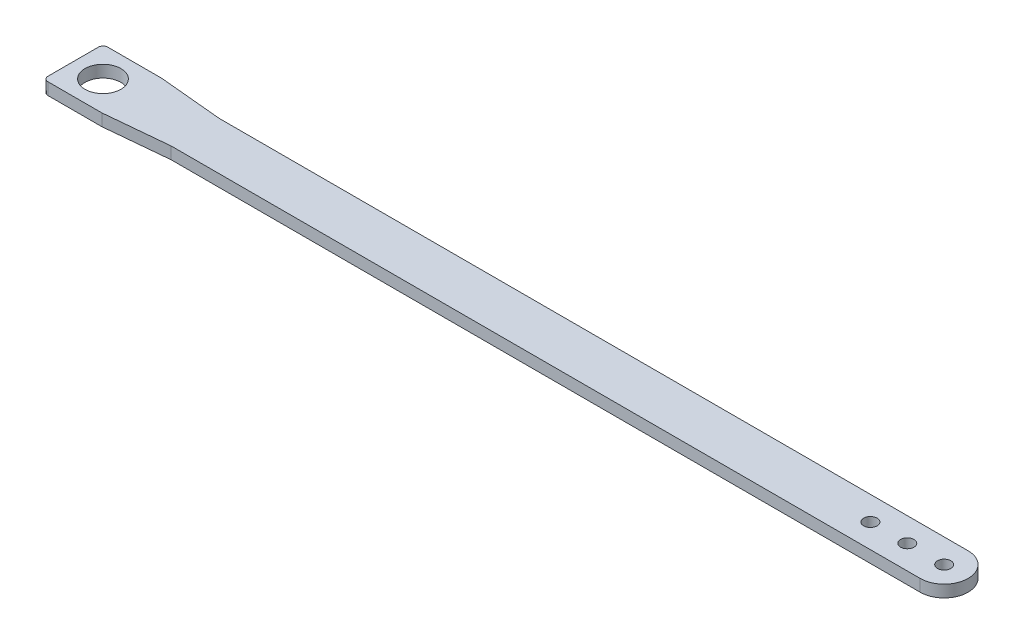
ISO-10303-21;
HEADER;
FILE_DESCRIPTION(('STEP AP214'),'2;1');
FILE_NAME('part.step','',(''),(''),'','','');
FILE_SCHEMA(('AUTOMOTIVE_DESIGN { 1 0 10303 214 1 1 1 1 }'));
ENDSEC;
DATA;
#1=APPLICATION_CONTEXT('core data for automotive mechanical design processes');
#2=APPLICATION_PROTOCOL_DEFINITION('international standard','automotive_design',2000,#1);
#3=PRODUCT_CONTEXT('',#1,'mechanical');
#4=PRODUCT('Part','Part','',(#3));
#5=PRODUCT_RELATED_PRODUCT_CATEGORY('part','',(#4));
#6=PRODUCT_DEFINITION_FORMATION('','',#4);
#7=PRODUCT_DEFINITION_CONTEXT('part definition',#1,'design');
#8=PRODUCT_DEFINITION('design','',#6,#7);
#9=PRODUCT_DEFINITION_SHAPE('','',#8);
#10=(LENGTH_UNIT() NAMED_UNIT(*) SI_UNIT(.MILLI.,.METRE.));
#11=(NAMED_UNIT(*) PLANE_ANGLE_UNIT() SI_UNIT($,.RADIAN.));
#12=(NAMED_UNIT(*) SI_UNIT($,.STERADIAN.) SOLID_ANGLE_UNIT());
#13=UNCERTAINTY_MEASURE_WITH_UNIT(LENGTH_MEASURE(1.E-05),#10,'distance_accuracy_value','');
#14=(GEOMETRIC_REPRESENTATION_CONTEXT(3) GLOBAL_UNCERTAINTY_ASSIGNED_CONTEXT((#13)) GLOBAL_UNIT_ASSIGNED_CONTEXT((#10,
#11,#12)) REPRESENTATION_CONTEXT('',''));
#15=CARTESIAN_POINT('',(0.,0.,0.));
#16=DIRECTION('',(0.,0.,1.));
#17=DIRECTION('',(1.,0.,0.));
#18=AXIS2_PLACEMENT_3D('',#15,#16,#17);
#19=CARTESIAN_POINT('',(187.756799999999,3.175,-0.63500000000008));
#20=DIRECTION('',(0.,1.,0.));
#21=DIRECTION('',(0.,0.,1.));
#22=AXIS2_PLACEMENT_3D('',#19,#20,#21);
#23=CYLINDRICAL_SURFACE('',#22,6.35000000000004);
#24=CARTESIAN_POINT('',(187.756799999999,6.35,-0.63500000000008));
#25=DIRECTION('',(0.,1.,0.));
#26=DIRECTION('',(0.,0.,1.));
#27=AXIS2_PLACEMENT_3D('',#24,#25,#26);
#28=CIRCLE('',#27,6.35000000000004);
#29=CARTESIAN_POINT('',(187.756799999999,6.35,5.71500000000001));
#30=VERTEX_POINT('',#29);
#31=CARTESIAN_POINT('',(187.756799999999,6.35,-6.98500000000008));
#32=VERTEX_POINT('',#31);
#33=EDGE_CURVE('E151',#30,#32,#28,.T.);
#34=ORIENTED_EDGE('',*,*,#33,.F.);
#35=DIRECTION('',(0.,1.,0.));
#36=VECTOR('',#35,1.);
#37=CARTESIAN_POINT('',(187.756799999999,3.175,5.71500000000001));
#38=LINE('',#37,#36);
#39=CARTESIAN_POINT('',(187.756799999999,3.175,5.71500000000001));
#40=VERTEX_POINT('',#39);
#41=EDGE_CURVE('E141',#40,#30,#38,.T.);
#42=ORIENTED_EDGE('',*,*,#41,.F.);
#43=CARTESIAN_POINT('',(187.756799999999,3.175,-0.63500000000008));
#44=DIRECTION('',(0.,1.,0.));
#45=DIRECTION('',(0.,0.,1.));
#46=AXIS2_PLACEMENT_3D('',#43,#44,#45);
#47=CIRCLE('',#46,6.35000000000004);
#48=CARTESIAN_POINT('',(187.756799999999,3.175,-6.98500000000008));
#49=VERTEX_POINT('',#48);
#50=EDGE_CURVE('E144',#40,#49,#47,.T.);
#51=ORIENTED_EDGE('',*,*,#50,.T.);
#52=DIRECTION('',(0.,1.,0.));
#53=VECTOR('',#52,1.);
#54=CARTESIAN_POINT('',(187.756799999999,3.175,-6.98500000000008));
#55=LINE('',#54,#53);
#56=EDGE_CURVE('E158',#49,#32,#55,.T.);
#57=ORIENTED_EDGE('',*,*,#56,.T.);
#58=EDGE_LOOP('',(#34,#42,#51,#57));
#59=FACE_BOUND('',#58,.T.);
#60=ADVANCED_FACE('F39',(#59),#23,.T.);
#61=CARTESIAN_POINT('',(-187.756799999999,3.175,5.71500000000001));
#62=DIRECTION('',(0.,0.,1.));
#63=DIRECTION('',(1.,0.,0.));
#64=AXIS2_PLACEMENT_3D('',#61,#62,#63);
#65=PLANE('',#64);
#66=DIRECTION('',(0.,1.,0.));
#67=VECTOR('',#66,1.);
#68=CARTESIAN_POINT('',(-10.7713521631986,-13.6843970823459,5.71500000000001));
#69=LINE('',#68,#67);
#70=CARTESIAN_POINT('',(-10.7713521631986,3.175,5.71500000000001));
#71=VERTEX_POINT('',#70);
#72=CARTESIAN_POINT('',(-10.7713521631986,6.35,5.71500000000001));
#73=VERTEX_POINT('',#72);
#74=EDGE_CURVE('E116',#71,#73,#69,.T.);
#75=ORIENTED_EDGE('',*,*,#74,.F.);
#76=DIRECTION('',(1.,0.,0.));
#77=VECTOR('',#76,1.);
#78=CARTESIAN_POINT('',(-187.756799999999,3.175,5.71500000000001));
#79=LINE('',#78,#77);
#80=EDGE_CURVE('E161',#71,#40,#79,.T.);
#81=ORIENTED_EDGE('',*,*,#80,.T.);
#82=ORIENTED_EDGE('',*,*,#41,.T.);
#83=DIRECTION('',(1.,0.,0.));
#84=VECTOR('',#83,1.);
#85=CARTESIAN_POINT('',(-187.756799999999,6.35,5.71500000000001));
#86=LINE('',#85,#84);
#87=EDGE_CURVE('E132',#73,#30,#86,.T.);
#88=ORIENTED_EDGE('',*,*,#87,.F.);
#89=EDGE_LOOP('',(#75,#81,#82,#88));
#90=FACE_BOUND('',#89,.T.);
#91=ADVANCED_FACE('F139',(#90),#65,.T.);
#92=CARTESIAN_POINT('',(187.756799999999,3.175,-6.98500000000008));
#93=DIRECTION('',(0.,0.,-1.));
#94=DIRECTION('',(-1.,0.,0.));
#95=AXIS2_PLACEMENT_3D('',#92,#93,#94);
#96=PLANE('',#95);
#97=DIRECTION('',(0.,1.,0.));
#98=VECTOR('',#97,1.);
#99=CARTESIAN_POINT('',(-10.7713521631986,-13.6843970823459,-6.98500000000012));
#100=LINE('',#99,#98);
#101=CARTESIAN_POINT('',(-10.7713521631986,3.175,-6.98500000000006));
#102=VERTEX_POINT('',#101);
#103=CARTESIAN_POINT('',(-10.7713521631986,6.35,-6.98500000000006));
#104=VERTEX_POINT('',#103);
#105=EDGE_CURVE('E60',#102,#104,#100,.T.);
#106=ORIENTED_EDGE('',*,*,#105,.T.);
#107=DIRECTION('',(-1.,0.,0.));
#108=VECTOR('',#107,1.);
#109=CARTESIAN_POINT('',(187.756799999999,6.35,-6.98500000000008));
#110=LINE('',#109,#108);
#111=EDGE_CURVE('E145',#32,#104,#110,.T.);
#112=ORIENTED_EDGE('',*,*,#111,.F.);
#113=ORIENTED_EDGE('',*,*,#56,.F.);
#114=DIRECTION('',(-1.,0.,0.));
#115=VECTOR('',#114,1.);
#116=CARTESIAN_POINT('',(187.756799999999,3.175,-6.98500000000008));
#117=LINE('',#116,#115);
#118=EDGE_CURVE('E55',#49,#102,#117,.T.);
#119=ORIENTED_EDGE('',*,*,#118,.T.);
#120=EDGE_LOOP('',(#106,#112,#113,#119));
#121=FACE_BOUND('',#120,.T.);
#122=ADVANCED_FACE('F262',(#121),#96,.T.);
#123=CARTESIAN_POINT('',(187.756799999999,3.175,-0.63500000000008));
#124=DIRECTION('',(0.,1.,0.));
#125=DIRECTION('',(0.,0.,1.));
#126=AXIS2_PLACEMENT_3D('',#123,#124,#125);
#127=PLANE('',#126);
#128=ORIENTED_EDGE('',*,*,#80,.F.);
#129=DIRECTION('',(-0.995556969872185,0.,0.0941611370944179));
#130=VECTOR('',#129,1.);
#131=CARTESIAN_POINT('',(-27.5558424363708,3.175,7.30250000000001));
#132=LINE('',#131,#130);
#133=CARTESIAN_POINT('',(-27.5558424363708,3.175,7.30250000000001));
#134=VERTEX_POINT('',#133);
#135=EDGE_CURVE('E122',#71,#134,#132,.T.);
#136=ORIENTED_EDGE('',*,*,#135,.T.);
#137=DIRECTION('',(-1.,0.,0.));
#138=VECTOR('',#137,1.);
#139=CARTESIAN_POINT('',(-41.5253638157058,3.175,7.30250000000001));
#140=LINE('',#139,#138);
#141=CARTESIAN_POINT('',(-41.8428638157058,3.175,7.30250000000001));
#142=VERTEX_POINT('',#141);
#143=EDGE_CURVE('E190',#134,#142,#140,.T.);
#144=ORIENTED_EDGE('',*,*,#143,.T.);
#145=CARTESIAN_POINT('',(-41.8428638157058,3.175,6.03250000000001));
#146=DIRECTION('',(0.,1.,0.));
#147=DIRECTION('',(0.,0.,1.));
#148=AXIS2_PLACEMENT_3D('',#145,#146,#147);
#149=CIRCLE('',#148,1.27);
#150=CARTESIAN_POINT('',(-43.1128638157058,3.175,6.03250000000001));
#151=VERTEX_POINT('',#150);
#152=EDGE_CURVE('E48',#142,#151,#149,.F.);
#153=ORIENTED_EDGE('',*,*,#152,.T.);
#154=DIRECTION('',(0.,0.,-1.));
#155=VECTOR('',#154,1.);
#156=CARTESIAN_POINT('',(-43.1128638157058,3.175,-8.57250000000008));
#157=LINE('',#156,#155);
#158=CARTESIAN_POINT('',(-43.1128638157058,3.175,-7.30250000000008));
#159=VERTEX_POINT('',#158);
#160=EDGE_CURVE('E187',#151,#159,#157,.T.);
#161=ORIENTED_EDGE('',*,*,#160,.T.);
#162=CARTESIAN_POINT('',(-41.8428638157058,3.175,-7.30250000000008));
#163=DIRECTION('',(0.,1.,0.));
#164=DIRECTION('',(0.,0.,1.));
#165=AXIS2_PLACEMENT_3D('',#162,#163,#164);
#166=CIRCLE('',#165,1.27);
#167=CARTESIAN_POINT('',(-41.8428638157058,3.175,-8.57250000000008));
#168=VERTEX_POINT('',#167);
#169=EDGE_CURVE('E177',#159,#168,#166,.F.);
#170=ORIENTED_EDGE('',*,*,#169,.T.);
#171=DIRECTION('',(1.,0.,0.));
#172=VECTOR('',#171,1.);
#173=CARTESIAN_POINT('',(-41.5253638157058,3.175,-8.57250000000008));
#174=LINE('',#173,#172);
#175=CARTESIAN_POINT('',(-27.5558424363708,3.175,-8.57250000000008));
#176=VERTEX_POINT('',#175);
#177=EDGE_CURVE('E219',#168,#176,#174,.T.);
#178=ORIENTED_EDGE('',*,*,#177,.T.);
#179=DIRECTION('',(0.995556969872185,0.,0.0941611370944156));
#180=VECTOR('',#179,1.);
#181=CARTESIAN_POINT('',(-27.5558424363708,3.175,-8.57250000000008));
#182=LINE('',#181,#180);
#183=EDGE_CURVE('E428',#176,#102,#182,.T.);
#184=ORIENTED_EDGE('',*,*,#183,.T.);
#185=ORIENTED_EDGE('',*,*,#118,.F.);
#186=ORIENTED_EDGE('',*,*,#50,.F.);
#187=EDGE_LOOP('',(#128,#136,#144,#153,#161,#170,#178,#184,#185,#186));
#188=FACE_BOUND('',#187,.T.);
#189=CARTESIAN_POINT('',(168.198799999999,3.175,-0.63500000000008));
#190=DIRECTION('',(0.,1.,0.));
#191=DIRECTION('',(0.,0.,1.));
#192=AXIS2_PLACEMENT_3D('',#189,#190,#191);
#193=CIRCLE('',#192,1.77800000000001);
#194=CARTESIAN_POINT('',(168.198799999999,3.175,1.14299999999993));
#195=VERTEX_POINT('',#194);
#196=EDGE_CURVE('E234',#195,#195,#193,.T.);
#197=ORIENTED_EDGE('',*,*,#196,.T.);
#198=EDGE_LOOP('',(#197));
#199=FACE_BOUND('',#198,.T.);
#200=CARTESIAN_POINT('',(177.977799999999,3.175,-0.63500000000008));
#201=DIRECTION('',(0.,1.,0.));
#202=DIRECTION('',(0.,0.,1.));
#203=AXIS2_PLACEMENT_3D('',#200,#201,#202);
#204=CIRCLE('',#203,1.77800000000001);
#205=CARTESIAN_POINT('',(177.977799999999,3.175,1.14299999999993));
#206=VERTEX_POINT('',#205);
#207=EDGE_CURVE('E227',#206,#206,#204,.T.);
#208=ORIENTED_EDGE('',*,*,#207,.T.);
#209=EDGE_LOOP('',(#208));
#210=FACE_BOUND('',#209,.T.);
#211=CARTESIAN_POINT('',(-35.2043999999998,3.175,-0.635000000000079));
#212=DIRECTION('',(0.,1.,0.));
#213=DIRECTION('',(0.,0.,1.));
#214=AXIS2_PLACEMENT_3D('',#211,#212,#213);
#215=CIRCLE('',#214,4.7625);
#216=CARTESIAN_POINT('',(-35.2043999999998,3.175,4.12749999999992));
#217=VERTEX_POINT('',#216);
#218=EDGE_CURVE('E242',#217,#217,#215,.T.);
#219=ORIENTED_EDGE('',*,*,#218,.T.);
#220=EDGE_LOOP('',(#219));
#221=FACE_BOUND('',#220,.T.);
#222=CARTESIAN_POINT('',(187.756799999999,3.175,-0.63500000000008));
#223=DIRECTION('',(0.,1.,0.));
#224=DIRECTION('',(0.,0.,-1.));
#225=AXIS2_PLACEMENT_3D('',#222,#223,#224);
#226=CIRCLE('',#225,1.77800000000001);
#227=CARTESIAN_POINT('',(187.756799999999,3.175,-2.41300000000009));
#228=VERTEX_POINT('',#227);
#229=EDGE_CURVE('E247',#228,#228,#226,.T.);
#230=ORIENTED_EDGE('',*,*,#229,.T.);
#231=EDGE_LOOP('',(#230));
#232=FACE_BOUND('',#231,.T.);
#233=ADVANCED_FACE('F185',(#188,#199,#210,#221,#232),#127,.F.);
#234=CARTESIAN_POINT('',(187.756799999999,6.35,-0.63500000000008));
#235=DIRECTION('',(0.,1.,0.));
#236=DIRECTION('',(0.,0.,1.));
#237=AXIS2_PLACEMENT_3D('',#234,#235,#236);
#238=PLANE('',#237);
#239=DIRECTION('',(0.995556969872185,0.,-0.0941611370944179));
#240=VECTOR('',#239,1.);
#241=CARTESIAN_POINT('',(-27.5558424363708,6.35,7.30250000000001));
#242=LINE('',#241,#240);
#243=CARTESIAN_POINT('',(-27.5558424363708,6.35,7.30250000000001));
#244=VERTEX_POINT('',#243);
#245=EDGE_CURVE('E120',#244,#73,#242,.T.);
#246=ORIENTED_EDGE('',*,*,#245,.T.);
#247=ORIENTED_EDGE('',*,*,#87,.T.);
#248=ORIENTED_EDGE('',*,*,#33,.T.);
#249=ORIENTED_EDGE('',*,*,#111,.T.);
#250=DIRECTION('',(-0.995556969872185,0.,-0.0941611370944155));
#251=VECTOR('',#250,1.);
#252=CARTESIAN_POINT('',(-27.5558424363708,6.35,-8.57250000000008));
#253=LINE('',#252,#251);
#254=CARTESIAN_POINT('',(-27.5558424363708,6.35,-8.57250000000008));
#255=VERTEX_POINT('',#254);
#256=EDGE_CURVE('E435',#104,#255,#253,.T.);
#257=ORIENTED_EDGE('',*,*,#256,.T.);
#258=DIRECTION('',(-1.,0.,0.));
#259=VECTOR('',#258,1.);
#260=CARTESIAN_POINT('',(-41.5253638157058,6.35,-8.57250000000008));
#261=LINE('',#260,#259);
#262=CARTESIAN_POINT('',(-41.8428638157058,6.35,-8.57250000000008));
#263=VERTEX_POINT('',#262);
#264=EDGE_CURVE('E213',#255,#263,#261,.T.);
#265=ORIENTED_EDGE('',*,*,#264,.T.);
#266=CARTESIAN_POINT('',(-41.8428638157058,6.35,-7.30250000000008));
#267=DIRECTION('',(0.,1.,0.));
#268=DIRECTION('',(0.,0.,1.));
#269=AXIS2_PLACEMENT_3D('',#266,#267,#268);
#270=CIRCLE('',#269,1.27);
#271=CARTESIAN_POINT('',(-43.1128638157058,6.35,-7.30250000000008));
#272=VERTEX_POINT('',#271);
#273=EDGE_CURVE('E168',#263,#272,#270,.T.);
#274=ORIENTED_EDGE('',*,*,#273,.T.);
#275=DIRECTION('',(0.,0.,1.));
#276=VECTOR('',#275,1.);
#277=CARTESIAN_POINT('',(-43.1128638157058,6.35,-8.57250000000008));
#278=LINE('',#277,#276);
#279=CARTESIAN_POINT('',(-43.1128638157058,6.35,6.03250000000001));
#280=VERTEX_POINT('',#279);
#281=EDGE_CURVE('E203',#272,#280,#278,.T.);
#282=ORIENTED_EDGE('',*,*,#281,.T.);
#283=CARTESIAN_POINT('',(-41.8428638157058,6.35,6.03250000000001));
#284=DIRECTION('',(0.,1.,0.));
#285=DIRECTION('',(0.,0.,1.));
#286=AXIS2_PLACEMENT_3D('',#283,#284,#285);
#287=CIRCLE('',#286,1.27);
#288=CARTESIAN_POINT('',(-41.8428638157058,6.35,7.30250000000001));
#289=VERTEX_POINT('',#288);
#290=EDGE_CURVE('E171',#280,#289,#287,.T.);
#291=ORIENTED_EDGE('',*,*,#290,.T.);
#292=DIRECTION('',(1.,0.,0.));
#293=VECTOR('',#292,1.);
#294=CARTESIAN_POINT('',(-41.5253638157058,6.35,7.30250000000001));
#295=LINE('',#294,#293);
#296=EDGE_CURVE('E135',#289,#244,#295,.T.);
#297=ORIENTED_EDGE('',*,*,#296,.T.);
#298=EDGE_LOOP('',(#246,#247,#248,#249,#257,#265,#274,#282,#291,#297));
#299=FACE_BOUND('',#298,.T.);
#300=CARTESIAN_POINT('',(168.198799999999,6.35,-0.63500000000008));
#301=DIRECTION('',(0.,1.,0.));
#302=DIRECTION('',(0.,0.,1.));
#303=AXIS2_PLACEMENT_3D('',#300,#301,#302);
#304=CIRCLE('',#303,1.77800000000001);
#305=CARTESIAN_POINT('',(168.198799999999,6.35,1.14299999999993));
#306=VERTEX_POINT('',#305);
#307=EDGE_CURVE('E223',#306,#306,#304,.T.);
#308=ORIENTED_EDGE('',*,*,#307,.F.);
#309=EDGE_LOOP('',(#308));
#310=FACE_BOUND('',#309,.T.);
#311=CARTESIAN_POINT('',(177.977799999999,6.35,-0.63500000000008));
#312=DIRECTION('',(0.,1.,0.));
#313=DIRECTION('',(0.,0.,1.));
#314=AXIS2_PLACEMENT_3D('',#311,#312,#313);
#315=CIRCLE('',#314,1.77800000000001);
#316=CARTESIAN_POINT('',(177.977799999999,6.35,1.14299999999993));
#317=VERTEX_POINT('',#316);
#318=EDGE_CURVE('E222',#317,#317,#315,.T.);
#319=ORIENTED_EDGE('',*,*,#318,.F.);
#320=EDGE_LOOP('',(#319));
#321=FACE_BOUND('',#320,.T.);
#322=CARTESIAN_POINT('',(-35.2043999999998,6.35,-0.635000000000079));
#323=DIRECTION('',(0.,1.,0.));
#324=DIRECTION('',(0.,0.,1.));
#325=AXIS2_PLACEMENT_3D('',#322,#323,#324);
#326=CIRCLE('',#325,4.7625);
#327=CARTESIAN_POINT('',(-35.2043999999998,6.35,4.12749999999992));
#328=VERTEX_POINT('',#327);
#329=EDGE_CURVE('E238',#328,#328,#326,.T.);
#330=ORIENTED_EDGE('',*,*,#329,.F.);
#331=EDGE_LOOP('',(#330));
#332=FACE_BOUND('',#331,.T.);
#333=CARTESIAN_POINT('',(187.756799999999,6.35,-0.63500000000008));
#334=DIRECTION('',(0.,1.,0.));
#335=DIRECTION('',(0.,0.,-1.));
#336=AXIS2_PLACEMENT_3D('',#333,#334,#335);
#337=CIRCLE('',#336,1.77800000000001);
#338=CARTESIAN_POINT('',(187.756799999999,6.35,-2.41300000000009));
#339=VERTEX_POINT('',#338);
#340=EDGE_CURVE('E246',#339,#339,#337,.T.);
#341=ORIENTED_EDGE('',*,*,#340,.F.);
#342=EDGE_LOOP('',(#341));
#343=FACE_BOUND('',#342,.T.);
#344=ADVANCED_FACE('F129',(#299,#310,#321,#332,#343),#238,.T.);
#345=CARTESIAN_POINT('',(187.756799999999,3.175,-0.63500000000008));
#346=DIRECTION('',(0.,1.,0.));
#347=DIRECTION('',(0.,0.,1.));
#348=AXIS2_PLACEMENT_3D('',#345,#346,#347);
#349=CYLINDRICAL_SURFACE('',#348,1.77800000000001);
#350=ORIENTED_EDGE('',*,*,#229,.F.);
#351=EDGE_LOOP('',(#350));
#352=FACE_BOUND('',#351,.T.);
#353=ORIENTED_EDGE('',*,*,#340,.T.);
#354=EDGE_LOOP('',(#353));
#355=FACE_BOUND('',#354,.T.);
#356=ADVANCED_FACE('F307',(#352,#355),#349,.F.);
#357=CARTESIAN_POINT('',(-35.2043999999998,-120.65,-0.635000000000079));
#358=DIRECTION('',(0.,1.,0.));
#359=DIRECTION('',(0.,0.,1.));
#360=AXIS2_PLACEMENT_3D('',#357,#358,#359);
#361=CYLINDRICAL_SURFACE('',#360,4.7625);
#362=ORIENTED_EDGE('',*,*,#329,.T.);
#363=EDGE_LOOP('',(#362));
#364=FACE_BOUND('',#363,.T.);
#365=ORIENTED_EDGE('',*,*,#218,.F.);
#366=EDGE_LOOP('',(#365));
#367=FACE_BOUND('',#366,.T.);
#368=ADVANCED_FACE('F303',(#364,#367),#361,.F.);
#369=CARTESIAN_POINT('',(177.977799999999,-120.65,-0.63500000000008));
#370=DIRECTION('',(0.,1.,0.));
#371=DIRECTION('',(0.,0.,1.));
#372=AXIS2_PLACEMENT_3D('',#369,#370,#371);
#373=CYLINDRICAL_SURFACE('',#372,1.77800000000001);
#374=ORIENTED_EDGE('',*,*,#318,.T.);
#375=EDGE_LOOP('',(#374));
#376=FACE_BOUND('',#375,.T.);
#377=ORIENTED_EDGE('',*,*,#207,.F.);
#378=EDGE_LOOP('',(#377));
#379=FACE_BOUND('',#378,.T.);
#380=ADVANCED_FACE('F299',(#376,#379),#373,.F.);
#381=CARTESIAN_POINT('',(168.198799999999,-120.65,-0.63500000000008));
#382=DIRECTION('',(0.,1.,0.));
#383=DIRECTION('',(0.,0.,1.));
#384=AXIS2_PLACEMENT_3D('',#381,#382,#383);
#385=CYLINDRICAL_SURFACE('',#384,1.77800000000001);
#386=ORIENTED_EDGE('',*,*,#307,.T.);
#387=EDGE_LOOP('',(#386));
#388=FACE_BOUND('',#387,.T.);
#389=ORIENTED_EDGE('',*,*,#196,.F.);
#390=EDGE_LOOP('',(#389));
#391=FACE_BOUND('',#390,.T.);
#392=ADVANCED_FACE('F296',(#388,#391),#385,.F.);
#393=CARTESIAN_POINT('',(-41.5253638157058,-19.0519327437928,7.30250000000001));
#394=DIRECTION('',(0.,0.,1.));
#395=DIRECTION('',(1.,0.,0.));
#396=AXIS2_PLACEMENT_3D('',#393,#394,#395);
#397=PLANE('',#396);
#398=ORIENTED_EDGE('',*,*,#296,.F.);
#399=DIRECTION('',(0.,1.,0.));
#400=VECTOR('',#399,1.);
#401=CARTESIAN_POINT('',(-41.8428638157058,-19.0519327437928,7.30250000000001));
#402=LINE('',#401,#400);
#403=EDGE_CURVE('E174',#289,#142,#402,.F.);
#404=ORIENTED_EDGE('',*,*,#403,.T.);
#405=ORIENTED_EDGE('',*,*,#143,.F.);
#406=DIRECTION('',(0.,1.,0.));
#407=VECTOR('',#406,1.);
#408=CARTESIAN_POINT('',(-27.5558424363708,-19.0519327437928,7.30250000000001));
#409=LINE('',#408,#407);
#410=EDGE_CURVE('E200',#134,#244,#409,.T.);
#411=ORIENTED_EDGE('',*,*,#410,.T.);
#412=EDGE_LOOP('',(#398,#404,#405,#411));
#413=FACE_BOUND('',#412,.T.);
#414=ADVANCED_FACE('F205',(#413),#397,.T.);
#415=CARTESIAN_POINT('',(-43.1128638157058,-19.0519327437928,-8.57250000000008));
#416=DIRECTION('',(-1.,0.,0.));
#417=DIRECTION('',(0.,0.,1.));
#418=AXIS2_PLACEMENT_3D('',#415,#416,#417);
#419=PLANE('',#418);
#420=ORIENTED_EDGE('',*,*,#160,.F.);
#421=DIRECTION('',(0.,1.,0.));
#422=VECTOR('',#421,1.);
#423=CARTESIAN_POINT('',(-43.1128638157058,-19.0519327437928,6.03250000000001));
#424=LINE('',#423,#422);
#425=EDGE_CURVE('E164',#151,#280,#424,.T.);
#426=ORIENTED_EDGE('',*,*,#425,.T.);
#427=ORIENTED_EDGE('',*,*,#281,.F.);
#428=DIRECTION('',(0.,1.,0.));
#429=VECTOR('',#428,1.);
#430=CARTESIAN_POINT('',(-43.1128638157058,-19.0519327437928,-7.30250000000008));
#431=LINE('',#430,#429);
#432=EDGE_CURVE('E157',#272,#159,#431,.F.);
#433=ORIENTED_EDGE('',*,*,#432,.T.);
#434=EDGE_LOOP('',(#420,#426,#427,#433));
#435=FACE_BOUND('',#434,.T.);
#436=ADVANCED_FACE('F195',(#435),#419,.T.);
#437=CARTESIAN_POINT('',(-41.5253638157058,-19.0519327437928,-8.57250000000008));
#438=DIRECTION('',(0.,0.,-1.));
#439=DIRECTION('',(-1.,0.,0.));
#440=AXIS2_PLACEMENT_3D('',#437,#438,#439);
#441=PLANE('',#440);
#442=ORIENTED_EDGE('',*,*,#177,.F.);
#443=DIRECTION('',(0.,1.,0.));
#444=VECTOR('',#443,1.);
#445=CARTESIAN_POINT('',(-41.8428638157058,-19.0519327437928,-8.57250000000008));
#446=LINE('',#445,#444);
#447=EDGE_CURVE('E11',#168,#263,#446,.T.);
#448=ORIENTED_EDGE('',*,*,#447,.T.);
#449=ORIENTED_EDGE('',*,*,#264,.F.);
#450=DIRECTION('',(0.,1.,0.));
#451=VECTOR('',#450,1.);
#452=CARTESIAN_POINT('',(-27.5558424363708,-19.0519327437928,-8.57250000000008));
#453=LINE('',#452,#451);
#454=EDGE_CURVE('E207',#176,#255,#453,.T.);
#455=ORIENTED_EDGE('',*,*,#454,.F.);
#456=EDGE_LOOP('',(#442,#448,#449,#455));
#457=FACE_BOUND('',#456,.T.);
#458=ADVANCED_FACE('F278',(#457),#441,.T.);
#459=CARTESIAN_POINT('',(-41.8428638157058,-19.0519327437928,6.03250000000001));
#460=DIRECTION('',(0.,1.,0.));
#461=DIRECTION('',(0.,0.,1.));
#462=AXIS2_PLACEMENT_3D('',#459,#460,#461);
#463=CYLINDRICAL_SURFACE('',#462,1.27);
#464=ORIENTED_EDGE('',*,*,#152,.F.);
#465=ORIENTED_EDGE('',*,*,#403,.F.);
#466=ORIENTED_EDGE('',*,*,#290,.F.);
#467=ORIENTED_EDGE('',*,*,#425,.F.);
#468=EDGE_LOOP('',(#464,#465,#466,#467));
#469=FACE_BOUND('',#468,.T.);
#470=ADVANCED_FACE('F202',(#469),#463,.T.);
#471=CARTESIAN_POINT('',(-41.8428638157058,-19.0519327437928,-7.30250000000008));
#472=DIRECTION('',(0.,1.,0.));
#473=DIRECTION('',(0.,0.,1.));
#474=AXIS2_PLACEMENT_3D('',#471,#472,#473);
#475=CYLINDRICAL_SURFACE('',#474,1.27);
#476=ORIENTED_EDGE('',*,*,#169,.F.);
#477=ORIENTED_EDGE('',*,*,#432,.F.);
#478=ORIENTED_EDGE('',*,*,#273,.F.);
#479=ORIENTED_EDGE('',*,*,#447,.F.);
#480=EDGE_LOOP('',(#476,#477,#478,#479));
#481=FACE_BOUND('',#480,.T.);
#482=ADVANCED_FACE('F41',(#481),#475,.T.);
#483=CARTESIAN_POINT('',(-27.5558424363708,-13.6843970823459,-8.57250000000008));
#484=DIRECTION('',(0.0941611370944155,0.,-0.995556969872185));
#485=DIRECTION('',(-0.995556969872185,0.,-0.0941611370944156));
#486=AXIS2_PLACEMENT_3D('',#483,#484,#485);
#487=PLANE('',#486);
#488=ORIENTED_EDGE('',*,*,#183,.F.);
#489=ORIENTED_EDGE('',*,*,#454,.T.);
#490=ORIENTED_EDGE('',*,*,#256,.F.);
#491=ORIENTED_EDGE('',*,*,#105,.F.);
#492=EDGE_LOOP('',(#488,#489,#490,#491));
#493=FACE_BOUND('',#492,.T.);
#494=ADVANCED_FACE('F283',(#493),#487,.T.);
#495=CARTESIAN_POINT('',(-27.5558424363708,-13.6843970823459,7.30250000000001));
#496=DIRECTION('',(0.0941611370944179,0.,0.995556969872185));
#497=DIRECTION('',(0.995556969872185,0.,-0.0941611370944179));
#498=AXIS2_PLACEMENT_3D('',#495,#496,#497);
#499=PLANE('',#498);
#500=ORIENTED_EDGE('',*,*,#135,.F.);
#501=ORIENTED_EDGE('',*,*,#74,.T.);
#502=ORIENTED_EDGE('',*,*,#245,.F.);
#503=ORIENTED_EDGE('',*,*,#410,.F.);
#504=EDGE_LOOP('',(#500,#501,#502,#503));
#505=FACE_BOUND('',#504,.T.);
#506=ADVANCED_FACE('F118',(#505),#499,.T.);
#507=CLOSED_SHELL('',(#60,#91,#122,#233,#344,#356,#368,#380,#392,#414,#436,#458,#470,#482,#494,#506));
#508=MANIFOLD_SOLID_BREP('B2',#507);
#509=ADVANCED_BREP_SHAPE_REPRESENTATION('',(#18,#508),#14);
#510=SHAPE_DEFINITION_REPRESENTATION(#9,#509);
ENDSEC;
END-ISO-10303-21;
